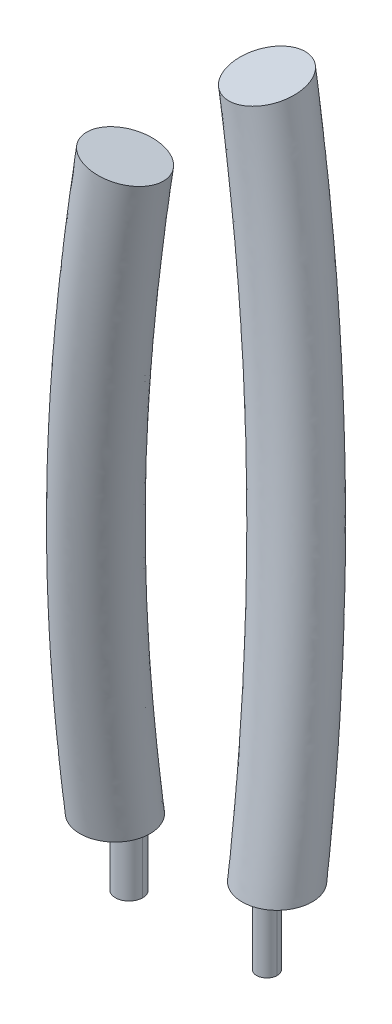
ISO-10303-21;
HEADER;
FILE_DESCRIPTION(('STEP AP214'),'2;1');
FILE_NAME('part.step','',(''),(''),'','','');
FILE_SCHEMA(('AUTOMOTIVE_DESIGN { 1 0 10303 214 1 1 1 1 }'));
ENDSEC;
DATA;
#1=APPLICATION_CONTEXT('core data for automotive mechanical design processes');
#2=APPLICATION_PROTOCOL_DEFINITION('international standard','automotive_design',2000,#1);
#3=PRODUCT_CONTEXT('',#1,'mechanical');
#4=PRODUCT('Part','Part','',(#3));
#5=PRODUCT_RELATED_PRODUCT_CATEGORY('part','',(#4));
#6=PRODUCT_DEFINITION_FORMATION('','',#4);
#7=PRODUCT_DEFINITION_CONTEXT('part definition',#1,'design');
#8=PRODUCT_DEFINITION('design','',#6,#7);
#9=PRODUCT_DEFINITION_SHAPE('','',#8);
#10=(LENGTH_UNIT() NAMED_UNIT(*) SI_UNIT(.MILLI.,.METRE.));
#11=(NAMED_UNIT(*) PLANE_ANGLE_UNIT() SI_UNIT($,.RADIAN.));
#12=(NAMED_UNIT(*) SI_UNIT($,.STERADIAN.) SOLID_ANGLE_UNIT());
#13=UNCERTAINTY_MEASURE_WITH_UNIT(LENGTH_MEASURE(1.E-05),#10,'distance_accuracy_value','');
#14=(GEOMETRIC_REPRESENTATION_CONTEXT(3) GLOBAL_UNCERTAINTY_ASSIGNED_CONTEXT((#13)) GLOBAL_UNIT_ASSIGNED_CONTEXT((#10,
#11,#12)) REPRESENTATION_CONTEXT('',''));
#15=CARTESIAN_POINT('',(0.,0.,0.));
#16=DIRECTION('',(0.,0.,1.));
#17=DIRECTION('',(1.,0.,0.));
#18=AXIS2_PLACEMENT_3D('',#15,#16,#17);
#19=CARTESIAN_POINT('',(0.,0.,0.));
#20=DIRECTION('',(0.,1.,0.));
#21=DIRECTION('',(0.,0.,1.));
#22=AXIS2_PLACEMENT_3D('',#19,#20,#21);
#23=PLANE('',#22);
#24=CARTESIAN_POINT('',(-0.956231117249001,0.,0.));
#25=DIRECTION('',(0.,-1.,0.));
#26=DIRECTION('',(0.,0.,-1.));
#27=AXIS2_PLACEMENT_3D('',#24,#25,#26);
#28=CIRCLE('',#27,0.193254320975);
#29=CARTESIAN_POINT('',(-1.149485438224,0.,0.));
#30=VERTEX_POINT('',#29);
#31=CARTESIAN_POINT('',(-0.762976796274001,0.,0.));
#32=VERTEX_POINT('',#31);
#33=EDGE_CURVE('P0_E46',#30,#32,#28,.F.);
#34=ORIENTED_EDGE('',*,*,#33,.F.);
#35=CARTESIAN_POINT('',(-0.956231117249001,0.,0.));
#36=DIRECTION('',(0.,-1.,0.));
#37=DIRECTION('',(0.,0.,-1.));
#38=AXIS2_PLACEMENT_3D('',#35,#36,#37);
#39=CIRCLE('',#38,0.193254320975);
#40=EDGE_CURVE('P0_E19',#32,#30,#39,.F.);
#41=ORIENTED_EDGE('',*,*,#40,.F.);
#42=EDGE_LOOP('',(#34,#41));
#43=FACE_BOUND('',#42,.T.);
#44=ADVANCED_FACE('P0_F16',(#43),#23,.F.);
#45=CARTESIAN_POINT('',(-0.956231117249001,0.5,0.));
#46=DIRECTION('',(0.,-1.,0.));
#47=DIRECTION('',(0.,0.,-1.));
#48=AXIS2_PLACEMENT_3D('',#45,#46,#47);
#49=CYLINDRICAL_SURFACE('',#48,0.193254320975);
#50=ORIENTED_EDGE('',*,*,#40,.T.);
#51=DIRECTION('',(0.,-1.,0.));
#52=VECTOR('',#51,1.);
#53=CARTESIAN_POINT('',(-1.149485438224,0.5,0.));
#54=LINE('',#53,#52);
#55=CARTESIAN_POINT('',(-1.149485438224,1.,0.));
#56=VERTEX_POINT('',#55);
#57=EDGE_CURVE('P0_E54',#56,#30,#54,.T.);
#58=ORIENTED_EDGE('',*,*,#57,.F.);
#59=CARTESIAN_POINT('',(-0.956231117249001,1.,0.));
#60=DIRECTION('',(0.,-1.,0.));
#61=DIRECTION('',(0.,0.,-1.));
#62=AXIS2_PLACEMENT_3D('',#59,#60,#61);
#63=CIRCLE('',#62,0.193254320975);
#64=CARTESIAN_POINT('',(-0.762976796274001,1.,0.));
#65=VERTEX_POINT('',#64);
#66=EDGE_CURVE('P0_E68',#65,#56,#63,.F.);
#67=ORIENTED_EDGE('',*,*,#66,.F.);
#68=DIRECTION('',(0.,-1.,0.));
#69=VECTOR('',#68,1.);
#70=CARTESIAN_POINT('',(-0.762976796274001,0.5,0.));
#71=LINE('',#70,#69);
#72=EDGE_CURVE('P0_E56',#32,#65,#71,.F.);
#73=ORIENTED_EDGE('',*,*,#72,.F.);
#74=EDGE_LOOP('',(#50,#58,#67,#73));
#75=FACE_BOUND('',#74,.T.);
#76=ADVANCED_FACE('P0_F52',(#75),#49,.T.);
#77=CARTESIAN_POINT('',(-0.956231117249001,0.5,0.));
#78=DIRECTION('',(0.,-1.,0.));
#79=DIRECTION('',(0.,0.,-1.));
#80=AXIS2_PLACEMENT_3D('',#77,#78,#79);
#81=CYLINDRICAL_SURFACE('',#80,0.193254320975);
#82=ORIENTED_EDGE('',*,*,#33,.T.);
#83=ORIENTED_EDGE('',*,*,#72,.T.);
#84=CARTESIAN_POINT('',(-0.956231117249001,1.,0.));
#85=DIRECTION('',(0.,-1.,0.));
#86=DIRECTION('',(0.,0.,-1.));
#87=AXIS2_PLACEMENT_3D('',#84,#85,#86);
#88=CIRCLE('',#87,0.193254320975);
#89=EDGE_CURVE('P0_E61',#56,#65,#88,.F.);
#90=ORIENTED_EDGE('',*,*,#89,.F.);
#91=ORIENTED_EDGE('',*,*,#57,.T.);
#92=EDGE_LOOP('',(#82,#83,#90,#91));
#93=FACE_BOUND('',#92,.T.);
#94=ADVANCED_FACE('P0_F59',(#93),#81,.T.);
#95=CARTESIAN_POINT('',(0.987813341373001,9.84483464318,0.987813341373001));
#96=DIRECTION('',(0.151428996103013,0.976213588915081,-0.155165356819013));
#97=DIRECTION('',(0.,0.156975577572689,0.987602484831686));
#98=AXIS2_PLACEMENT_3D('',#95,#96,#97);
#99=PLANE('',#98);
#100=CARTESIAN_POINT('',(-0.506269104120293,10.0795245649109,1.00624584472));
#101=CARTESIAN_POINT('',(-0.505260947537554,10.0837813301359,1.03401090958508));
#102=CARTESIAN_POINT('',(-0.501903312536936,10.0876661599394,1.06172886822156));
#103=CARTESIAN_POINT('',(-0.490588642986283,10.0945950164732,1.11636356973537));
#104=CARTESIAN_POINT('',(-0.482626074332374,10.0976380250054,1.14327930752387));
#105=CARTESIAN_POINT('',(-0.462326871086091,10.1027865042807,1.1954810590372));
#106=CARTESIAN_POINT('',(-0.449992934267402,10.1048925514622,1.22076806657802));
#107=CARTESIAN_POINT('',(-0.42130061310642,10.1081107793624,1.26901676945298));
#108=CARTESIAN_POINT('',(-0.40494211071025,10.1092229309224,1.2919783965481));
#109=CARTESIAN_POINT('',(-0.368665654274767,10.1104214918827,1.33492199564474));
#110=CARTESIAN_POINT('',(-0.348747822335922,10.1105079364624,1.35490406981474));
#111=CARTESIAN_POINT('',(-0.305916882342927,10.109652747313,1.39132327505448));
#112=CARTESIAN_POINT('',(-0.283003656722234,10.1087110732204,1.40776026691575));
#113=CARTESIAN_POINT('',(-0.234849670515615,10.1058273087174,1.43661167929145));
#114=CARTESIAN_POINT('',(-0.209610517926678,10.1038859052587,1.44902885244507));
#115=CARTESIAN_POINT('',(-0.157471828127672,10.0990548571257,1.46951779841927));
#116=CARTESIAN_POINT('',(-0.130570120722603,10.0961639508599,1.47758375194886));
#117=CARTESIAN_POINT('',(-0.0759205293118471,10.0895190813067,1.48911158811195));
#118=CARTESIAN_POINT('',(-0.0481732407897367,10.0857657137406,1.49257663754604));
#119=CARTESIAN_POINT('',(0.00739892286910944,10.0775011676025,1.49481473189501));
#120=CARTESIAN_POINT('',(0.0352238014431222,10.0729899549157,1.49358756553345));
#121=CARTESIAN_POINT('',(0.0901585720242738,10.0633381500564,1.4864757596256));
#122=CARTESIAN_POINT('',(0.117268499483148,10.0581975891623,1.48059135146481));
#123=CARTESIAN_POINT('',(0.170006765677359,10.0474325219921,1.46433190926677));
#124=CARTESIAN_POINT('',(0.195635023827805,10.041807989435,1.45395663124046));
#125=CARTESIAN_POINT('',(0.244663669550219,10.0302389429014,1.42901870750103));
#126=CARTESIAN_POINT('',(0.26806558945066,10.0242946534812,1.41445897000038));
#127=CARTESIAN_POINT('',(0.312027748020974,10.0122429400648,1.38153988953361));
#128=CARTESIAN_POINT('',(0.332584156432529,10.0061353091363,1.363175506639));
#129=CARTESIAN_POINT('',(0.370207983363639,9.9939465712159,1.32320863918377));
#130=CARTESIAN_POINT('',(0.387280130084355,9.98786543938719,1.30161061271027));
#131=CARTESIAN_POINT('',(0.417508150531316,9.9758851940415,1.25573774743593));
#132=CARTESIAN_POINT('',(0.430658496938887,9.96998634782534,1.23145919612052));
#133=CARTESIAN_POINT('',(0.452619748160395,9.95855617367261,1.18097936435931));
#134=CARTESIAN_POINT('',(0.461437276433102,9.95302429603082,1.1547810894428));
#135=CARTESIAN_POINT('',(0.474524211163998,9.94246605696488,1.10112636113496));
#136=CARTESIAN_POINT('',(0.478786003807387,9.93744055447784,1.0736678812202));
#137=CARTESIAN_POINT('',(0.482613968490641,9.92804854203275,1.01831438284252));
#138=CARTESIAN_POINT('',(0.482180140530655,9.92368203207468,0.990419364379611));
#139=CARTESIAN_POINT('',(0.476633973378437,9.91573879874136,0.935032369366834));
#140=CARTESIAN_POINT('',(0.471529429223418,9.91216077179501,0.907539798810871));
#141=CARTESIAN_POINT('',(0.456786010906743,9.90588180230009,0.853647637883457));
#142=CARTESIAN_POINT('',(0.447140184869622,9.90318221523512,0.827249790981019));
#143=CARTESIAN_POINT('',(0.423602496571732,9.89874755395539,0.776378480045671));
#144=CARTESIAN_POINT('',(0.409716601208795,9.89701113392073,0.751902372082963));
#145=CARTESIAN_POINT('',(0.378065957160012,9.89454450989236,0.705495253269818));
#146=CARTESIAN_POINT('',(0.360295928023082,9.89381568569548,0.683567770030391));
#147=CARTESIAN_POINT('',(0.321419380847913,9.89338971724339,0.642947409718558));
#148=CARTESIAN_POINT('',(0.300317336750514,9.89369120062842,0.624250264735543));
#149=CARTESIAN_POINT('',(0.255342212201253,9.89531482591288,0.590573076725535));
#150=CARTESIAN_POINT('',(0.231467219333462,9.8966376758107,0.575595621662889));
#151=CARTESIAN_POINT('',(0.181637217865073,9.90026723866851,0.549800698129511));
#152=CARTESIAN_POINT('',(0.155682322350299,9.9025738981675,0.538983003674752));
#153=CARTESIAN_POINT('',(0.102426754113464,9.90810573572821,0.52181304840052));
#154=CARTESIAN_POINT('',(0.0751260145941709,9.91133095941835,0.515461009460726));
#155=CARTESIAN_POINT('',(0.0199562751178808,9.91860814719594,0.50740374273523));
#156=CARTESIAN_POINT('',(-0.00791269919755409,9.92266007405243,0.505698305737367));
#157=CARTESIAN_POINT('',(-0.0634483075558613,9.93147880958214,0.506982535960994));
#158=CARTESIAN_POINT('',(-0.0911147889246117,9.93624610897875,0.50997543953717));
#159=CARTESIAN_POINT('',(-0.145403066839244,9.94635122833846,0.520570171761748));
#160=CARTESIAN_POINT('',(-0.172026206130195,9.95168827972284,0.528165854531095));
#161=CARTESIAN_POINT('',(-0.223529911797674,9.96279066938617,0.54775237355857));
#162=CARTESIAN_POINT('',(-0.248409269006033,9.96855629925041,0.559746224359752));
#163=CARTESIAN_POINT('',(-0.295697949649511,9.98034867280351,0.587787263719605));
#164=CARTESIAN_POINT('',(-0.318107370018242,9.98637540623232,0.603834293128322));
#165=CARTESIAN_POINT('',(-0.359821930896534,9.99851937813945,0.639527288242959));
#166=CARTESIAN_POINT('',(-0.379126964906217,10.0046366197149,0.65917337736971));
#167=CARTESIAN_POINT('',(-0.414083346820323,10.0167874303158,0.701504840594128));
#168=CARTESIAN_POINT('',(-0.429734801892504,10.0228210017906,0.72419012551456));
#169=CARTESIAN_POINT('',(-0.456948550026285,10.0346375410041,0.771974732511432));
#170=CARTESIAN_POINT('',(-0.468508316357693,10.0404203519643,0.797075534111202));
#171=CARTESIAN_POINT('',(-0.487186669501557,10.0515584875905,0.848921869256242));
#172=CARTESIAN_POINT('',(-0.494310581587915,10.0569143180848,0.875665388147101));
#173=CARTESIAN_POINT('',(-0.50512587384178,10.0683197327002,0.936867012526723));
#174=CARTESIAN_POINT('',(-0.507527353505232,10.0742118264753,0.971593116773343));
#175=CARTESIAN_POINT('',(-0.506269104120293,10.0795245649109,1.00624584472));
#176=B_SPLINE_CURVE_WITH_KNOTS('',3,(#100,#101,#102,#103,#104,#105,#106,#107,#108,#109,#110,
#111,#112,#113,#114,#115,#116,#117,#118,#119,#120,#121,#122,#123,#124,#125,#126,#127,#128,#129,
#130,#131,#132,#133,#134,#135,#136,#137,#138,#139,#140,#141,#142,#143,#144,#145,#146,#147,#148,
#149,#150,#151,#152,#153,#154,#155,#156,#157,#158,#159,#160,#161,#162,#163,#164,#165,#166,#167,
#168,#169,#170,#171,#172,#173,#174,#175),.UNSPECIFIED.,.T.,.F.,(4,2,2,2,2,2,2,2,2,2,2,2,2,2,2,2,
2,2,2,2,2,2,2,2,2,2,2,2,2,2,2,2,2,2,2,2,2,4),(0.,0.084191603812493,0.168484598046045,
0.252725661495634,0.336969196310121,0.421209841759927,0.505453794573552,0.589639937282029,
0.673938392570009,0.758178795132454,0.842422990832698,0.92666300129583,1.01090758909495,
1.09509376764645,1.17939218709014,1.26357544020016,1.34787678505799,1.43204885675008,
1.51636138290278,1.60067390905282,1.68484598074221,1.76914732560252,1.85333057871515,
1.93762899815938,2.02181517671146,2.106059764511,2.19029977497459,2.27454397067501,
2.35878437323759,2.44308282852515,2.52726897123328,2.61151292404623,2.69575356949507,
2.77999710430893,2.86423816775821,2.94853116199142,3.0327227658033,3.13779973056044),.UNSPECIFIED.);
#177=CARTESIAN_POINT('',(-0.506269104120293,10.0795245649109,1.00624584472));
#178=VERTEX_POINT('',#177);
#179=EDGE_CURVE('P0_E26',#178,#178,#176,.T.);
#180=ORIENTED_EDGE('',*,*,#179,.T.);
#181=EDGE_LOOP('',(#180));
#182=FACE_BOUND('',#181,.T.);
#183=ADVANCED_FACE('P0_F88',(#182),#99,.T.);
#184=CARTESIAN_POINT('',(0.,1.,0.));
#185=DIRECTION('',(0.,-1.,0.));
#186=DIRECTION('',(0.,0.,-1.));
#187=AXIS2_PLACEMENT_3D('',#184,#185,#186);
#188=PLANE('',#187);
#189=ORIENTED_EDGE('',*,*,#66,.T.);
#190=ORIENTED_EDGE('',*,*,#89,.T.);
#191=EDGE_LOOP('',(#189,#190));
#192=FACE_BOUND('',#191,.T.);
#193=CARTESIAN_POINT('',(-1.50035786804304,1.,0.156365584134835));
#194=CARTESIAN_POINT('',(-1.5004608842237,1.,0.128348709359291));
#195=CARTESIAN_POINT('',(-1.49819778701348,1.,0.100342505934758));
#196=CARTESIAN_POINT('',(-1.48900357452294,0.999999999999999,0.045062846648729));
#197=CARTESIAN_POINT('',(-1.48206704196627,0.999999999999995,0.0177902793869721));
#198=CARTESIAN_POINT('',(-1.46371145529497,1.,-0.0351849092875141));
#199=CARTESIAN_POINT('',(-1.45229458550649,1.00000000000002,-0.0608882886901258));
#200=CARTESIAN_POINT('',(-1.42529947843465,0.999999999999985,-0.110009631362051));
#201=CARTESIAN_POINT('',(-1.4097211742752,0.999999999999943,-0.133427557894875));
#202=CARTESIAN_POINT('',(-1.37487806658665,0.999999999999943,-0.177266419655311));
#203=CARTESIAN_POINT('',(-1.35562017089401,0.999999999999985,-0.197692845979856));
#204=CARTESIAN_POINT('',(-1.31394641824274,1.00000000000002,-0.235021486100481));
#205=CARTESIAN_POINT('',(-1.29153046056062,1.,-0.251923587448801));
#206=CARTESIAN_POINT('',(-1.2442057980502,0.999999999999996,-0.281709238172104));
#207=CARTESIAN_POINT('',(-1.21929983092817,0.999999999999999,-0.294597138255301));
#208=CARTESIAN_POINT('',(-1.16764717421988,1.,-0.316034846345034));
#209=CARTESIAN_POINT('',(-1.14089806311904,1.,-0.324578818985901));
#210=CARTESIAN_POINT('',(-1.08631373586228,0.999999999999999,-0.337076336908561));
#211=CARTESIAN_POINT('',(-1.05847721851566,1.,-0.341024197045201));
#212=CARTESIAN_POINT('',(-1.00253453239311,1.,-0.344207997036625));
#213=CARTESIAN_POINT('',(-0.974428343388665,1.,-0.343443580613049));
#214=CARTESIAN_POINT('',(-0.918643480993769,1.,-0.337221743916044));
#215=CARTESIAN_POINT('',(-0.890966588929231,0.999999999999999,-0.331748354558699));
#216=CARTESIAN_POINT('',(-0.836916731217575,1.,-0.31624894382472));
#217=CARTESIAN_POINT('',(-0.810543863018822,1.00000000000001,-0.306222582777634));
#218=CARTESIAN_POINT('',(-0.759772699757621,1.00000000000001,-0.28187058356781));
#219=CARTESIAN_POINT('',(-0.73538015318772,1.,-0.267532960197675));
#220=CARTESIAN_POINT('',(-0.689308719030558,0.999999999999999,-0.234954438337665));
#221=CARTESIAN_POINT('',(-0.667633531156166,1.,-0.216708307933375));
#222=CARTESIAN_POINT('',(-0.627638566024479,1.,-0.176830976572493));
#223=CARTESIAN_POINT('',(-0.609320444963431,0.999999999999999,-0.155198114490728));
#224=CARTESIAN_POINT('',(-0.576546732474856,1.,-0.109126412388754));
#225=CARTESIAN_POINT('',(-0.56209763021307,1.00000000000001,-0.0846829553194162));
#226=CARTESIAN_POINT('',(-0.537524629363408,0.999999999999997,-0.03372443894938));
#227=CARTESIAN_POINT('',(-0.527398744924007,0.999999999999985,-0.00721033742540048));
#228=CARTESIAN_POINT('',(-0.511771773316084,1.00000000000001,0.0471009250426322));
#229=CARTESIAN_POINT('',(-0.506263162763886,1.00000000000006,0.0748959206148224));
#230=CARTESIAN_POINT('',(-0.500015031138764,1.00000000000006,0.130964643546581));
#231=CARTESIAN_POINT('',(-0.499266622037075,1.00000000000002,0.159237379819447));
#232=CARTESIAN_POINT('',(-0.502545973420364,0.999999999999985,0.215502873660706));
#233=CARTESIAN_POINT('',(-0.506573348449895,0.999999999999996,0.243495653640607));
#234=CARTESIAN_POINT('',(-0.519272843076971,1.,0.298297524987755));
#235=CARTESIAN_POINT('',(-0.527927674824567,1.,0.325110622630855));
#236=CARTESIAN_POINT('',(-0.549629691470085,0.999999999999999,0.376894490698036));
#237=CARTESIAN_POINT('',(-0.562676579673579,1.,0.401865385428667));
#238=CARTESIAN_POINT('',(-0.592756381911376,1.,0.449192811317491));
#239=CARTESIAN_POINT('',(-0.609779534560019,1.,0.471555546883358));
#240=CARTESIAN_POINT('',(-0.647319454017895,1.,0.51307140488102));
#241=CARTESIAN_POINT('',(-0.667831523709135,1.,0.532228774786566));
#242=CARTESIAN_POINT('',(-0.711772331517792,1.,0.566820977004129));
#243=CARTESIAN_POINT('',(-0.735199952065666,1.,0.582257229047162));
#244=CARTESIAN_POINT('',(-0.784309927531747,1.,0.60898273240931));
#245=CARTESIAN_POINT('',(-0.80999216974511,1.,0.620272190873759));
#246=CARTESIAN_POINT('',(-0.862922325330329,1.,0.638405991843061));
#247=CARTESIAN_POINT('',(-0.890172465223268,1.,0.645243834275488));
#248=CARTESIAN_POINT('',(-0.945431602621775,1.,0.654263333338952));
#249=CARTESIAN_POINT('',(-0.973440588333186,1.,0.656445062294389));
#250=CARTESIAN_POINT('',(-1.02953909597929,1.,0.656099390349216));
#251=CARTESIAN_POINT('',(-1.05762850430313,1.,0.653553533050036));
#252=CARTESIAN_POINT('',(-1.11294828049717,1.,0.64380327320705));
#253=CARTESIAN_POINT('',(-1.14017971779322,1.,0.636604931931413));
#254=CARTESIAN_POINT('',(-1.19317310559319,1.,0.617723546396409));
#255=CARTESIAN_POINT('',(-1.21892823356832,1.,0.606021350424069));
#256=CARTESIAN_POINT('',(-1.26811435014393,1.,0.578470001941614));
#257=CARTESIAN_POINT('',(-1.29154539216137,0.999999999999999,0.562620944773728));
#258=CARTESIAN_POINT('',(-1.33547852707387,0.999999999999999,0.527180165252237));
#259=CARTESIAN_POINT('',(-1.35597322321546,1.,0.507579271984436));
#260=CARTESIAN_POINT('',(-1.3933816416812,1.,0.46521716994935));
#261=CARTESIAN_POINT('',(-1.41029547582756,1.,0.44245605990525));
#262=CARTESIAN_POINT('',(-1.44007216717533,1.,0.394392482759653));
#263=CARTESIAN_POINT('',(-1.45293157060783,1.,0.369087873042556));
#264=CARTESIAN_POINT('',(-1.47419541848673,1.,0.316717223403416));
#265=CARTESIAN_POINT('',(-1.48260522368378,1.,0.289653347360505));
#266=CARTESIAN_POINT('',(-1.49629801481369,1.,0.227382125442541));
#267=CARTESIAN_POINT('',(-1.50022733799735,1.,0.191865288365974));
#268=CARTESIAN_POINT('',(-1.50035786804304,1.,0.156365584134835));
#269=B_SPLINE_CURVE_WITH_KNOTS('',3,(#193,#194,#195,#196,#197,#198,#199,#200,#201,#202,#203,
#204,#205,#206,#207,#208,#209,#210,#211,#212,#213,#214,#215,#216,#217,#218,#219,#220,#221,#222,
#223,#224,#225,#226,#227,#228,#229,#230,#231,#232,#233,#234,#235,#236,#237,#238,#239,#240,#241,
#242,#243,#244,#245,#246,#247,#248,#249,#250,#251,#252,#253,#254,#255,#256,#257,#258,#259,#260,
#261,#262,#263,#264,#265,#266,#267,#268),.UNSPECIFIED.,.T.,.F.,(4,2,2,2,2,2,2,2,2,2,2,2,2,2,2,2,
2,2,2,2,2,2,2,2,2,2,2,2,2,2,2,2,2,2,2,2,2,4),(0.,0.0839191420163342,0.167935727796411,
0.251911403244371,0.335888428299487,0.419709322182167,0.503532890060572,0.587265288813188,
0.671109873292562,0.755058059212508,0.839012592232113,0.923252959426419,1.00749961233208,
1.09198266888544,1.17657952886279,1.2612180126859,1.3459975764539,1.43073815508562,
1.5153403875588,1.59978460815646,1.68422201369114,1.76834614896586,1.85246460258425,
1.9363786836261,2.02018067288497,2.10395063809528,2.18771641816406,2.27160423698052,
2.35549075274019,2.43970544841649,2.52381064952067,2.60827751416114,2.69274243695906,
2.77741652346778,2.86208796540618,2.9468313410915,3.03147238651818,3.13780490021851),.UNSPECIFIED.);
#270=CARTESIAN_POINT('',(-1.50035786804304,1.,0.156365584134835));
#271=VERTEX_POINT('',#270);
#272=EDGE_CURVE('P0_E11',#271,#271,#269,.T.);
#273=ORIENTED_EDGE('',*,*,#272,.T.);
#274=EDGE_LOOP('',(#273));
#275=FACE_BOUND('',#274,.T.);
#276=ADVANCED_FACE('P0_F92',(#192,#275),#188,.T.);
#277=CARTESIAN_POINT('',(-1.51251494884,0.,0.));
#278=CARTESIAN_POINT('',(-1.51251494884,0.,2.));
#279=CARTESIAN_POINT('',(0.487485051155,0.,1.));
#280=CARTESIAN_POINT('',(0.487485051155,0.,-1.));
#281=CARTESIAN_POINT('',(-1.51251494884,0.,-2.));
#282=CARTESIAN_POINT('',(-1.51251494884,0.,0.));
#283=CARTESIAN_POINT('',(-1.51251494889,2.0317842466,0.319151941971));
#284=CARTESIAN_POINT('',(-1.49733205582,2.03178424642,2.31915194198));
#285=CARTESIAN_POINT('',(0.49507649767,1.93512693964,1.30396904658));
#286=CARTESIAN_POINT('',(0.47989360455,1.93512693982,-0.696030953631));
#287=CARTESIAN_POINT('',(-1.52769784196,2.03178424679,-1.68084805825));
#288=CARTESIAN_POINT('',(-1.51251494889,2.0317842466,0.319151941971));
#289=CARTESIAN_POINT('',(-1.38674469461,4.06368746816,0.637546559239));
#290=CARTESIAN_POINT('',(-1.35933398124,4.1008606035,2.6374023603));
#291=CARTESIAN_POINT('',(0.620977483951,3.88849514312,1.61006387781));
#292=CARTESIAN_POINT('',(0.59356674387,3.85132200801,-0.38979185493));
#293=CARTESIAN_POINT('',(-1.41415540798,4.02651433282,-1.36230930453));
#294=CARTESIAN_POINT('',(-1.38674469461,4.06368746816,0.637546559239));
#295=CARTESIAN_POINT('',(-1.13593463826,6.07089006325,0.883712551017001));
#296=CARTESIAN_POINT('',(-1.09683778803,6.18352425452,2.88368691819));
#297=CARTESIAN_POINT('',(0.865437774574001,5.85656395609,1.85643064268));
#298=CARTESIAN_POINT('',(0.826341012838,5.74392955196,-0.143543697606));
#299=CARTESIAN_POINT('',(-1.17503148848,5.95825565912,-1.11626189048));
#300=CARTESIAN_POINT('',(-1.13593463826,6.07089006325,0.883712551017001));
#301=CARTESIAN_POINT('',(-0.820355032055,8.07999156209,1.00624584507));
#302=CARTESIAN_POINT('',(-0.763348601026,8.28774042502,2.99699654644));
#303=CARTESIAN_POINT('',(1.18395917747,7.87470864184,1.97724787699));
#304=CARTESIAN_POINT('',(1.12695274663,7.66695977813,-0.0135028241352));
#305=CARTESIAN_POINT('',(-0.877361463084001,7.87224269837,-0.984504856006001));
#306=CARTESIAN_POINT('',(-0.820355032055,8.07999156209,1.00624584507));
#307=CARTESIAN_POINT('',(-0.506269104122,10.0795245649,1.00624584472));
#308=CARTESIAN_POINT('',(-0.434322964699,10.3823825571,2.98187252747));
#309=CARTESIAN_POINT('',(1.50533064834,9.92062284738,1.96968586884));
#310=CARTESIAN_POINT('',(1.43338450891,9.61776485517,-0.00594081390411));
#311=CARTESIAN_POINT('',(-0.578215243546,9.77666657271,-0.969380838024001));
#312=CARTESIAN_POINT('',(-0.506269104122,10.0795245649,1.00624584472));
#313=(BOUNDED_SURFACE() B_SPLINE_SURFACE(5,5,((#277,#278,#279,#280,#281,#282),(#283,#284,#285,
#286,#287,#288),(#289,#290,#291,#292,#293,#294),(#295,#296,#297,#298,#299,#300),(#301,#302,#303,
#304,#305,#306),(#307,#308,#309,#310,#311,#312)),.UNSPECIFIED.,.F.,.T.,
.F.) B_SPLINE_SURFACE_WITH_KNOTS((6,6),(6,6),(0.,10.1231631988),(0.,3.14159265359),
.UNSPECIFIED.) GEOMETRIC_REPRESENTATION_ITEM() RATIONAL_B_SPLINE_SURFACE(((1.,0.2,0.2,0.2,0.2,
1.),(1.,0.2,0.2,0.2,0.2,1.),(1.,0.2,0.2,0.2,0.2,1.),(1.,0.2,0.2,0.2,0.2,1.),(1.,0.2,0.2,0.2,0.2,
1.),(1.,0.2,0.2,0.2,0.2,1.))) REPRESENTATION_ITEM('') SURFACE());
#314=ORIENTED_EDGE('',*,*,#272,.F.);
#315=EDGE_LOOP('',(#314));
#316=FACE_BOUND('',#315,.T.);
#317=ORIENTED_EDGE('',*,*,#179,.F.);
#318=EDGE_LOOP('',(#317));
#319=FACE_BOUND('',#318,.T.);
#320=ADVANCED_FACE('P0_F84',(#316,#319),#313,.F.);
#321=CLOSED_SHELL('',(#44,#76,#94,#183,#276,#320));
#322=MANIFOLD_SOLID_BREP('P0_B1',#321);
#323=CARTESIAN_POINT('',(0.,0.,0.));
#324=DIRECTION('',(0.,1.,0.));
#325=DIRECTION('',(0.,0.,1.));
#326=AXIS2_PLACEMENT_3D('',#323,#324,#325);
#327=PLANE('',#326);
#328=CARTESIAN_POINT('',(1.00340008736,0.,0.));
#329=DIRECTION('',(0.,-1.,0.));
#330=DIRECTION('',(0.,0.,-1.));
#331=AXIS2_PLACEMENT_3D('',#328,#329,#330);
#332=CIRCLE('',#331,0.146623174374);
#333=CARTESIAN_POINT('',(0.856776912986,0.,0.));
#334=VERTEX_POINT('',#333);
#335=CARTESIAN_POINT('',(1.150023261734,0.,0.));
#336=VERTEX_POINT('',#335);
#337=EDGE_CURVE('P1_E46',#334,#336,#332,.F.);
#338=ORIENTED_EDGE('',*,*,#337,.F.);
#339=CARTESIAN_POINT('',(1.00340008736,0.,0.));
#340=DIRECTION('',(0.,-1.,0.));
#341=DIRECTION('',(0.,0.,-1.));
#342=AXIS2_PLACEMENT_3D('',#339,#340,#341);
#343=CIRCLE('',#342,0.146623174374);
#344=EDGE_CURVE('P1_E19',#336,#334,#343,.F.);
#345=ORIENTED_EDGE('',*,*,#344,.F.);
#346=EDGE_LOOP('',(#338,#345));
#347=FACE_BOUND('',#346,.T.);
#348=ADVANCED_FACE('P1_F16',(#347),#327,.F.);
#349=CARTESIAN_POINT('',(1.00340008736,0.5,0.));
#350=DIRECTION('',(0.,-1.,0.));
#351=DIRECTION('',(0.,0.,-1.));
#352=AXIS2_PLACEMENT_3D('',#349,#350,#351);
#353=CYLINDRICAL_SURFACE('',#352,0.146623174374);
#354=ORIENTED_EDGE('',*,*,#344,.T.);
#355=DIRECTION('',(0.,-1.,0.));
#356=VECTOR('',#355,1.);
#357=CARTESIAN_POINT('',(0.856776912986,0.5,0.));
#358=LINE('',#357,#356);
#359=CARTESIAN_POINT('',(0.856776912986,1.,0.));
#360=VERTEX_POINT('',#359);
#361=EDGE_CURVE('P1_E54',#360,#334,#358,.T.);
#362=ORIENTED_EDGE('',*,*,#361,.F.);
#363=CARTESIAN_POINT('',(1.00340008736,1.,0.));
#364=DIRECTION('',(0.,-1.,0.));
#365=DIRECTION('',(0.,0.,-1.));
#366=AXIS2_PLACEMENT_3D('',#363,#364,#365);
#367=CIRCLE('',#366,0.146623174374);
#368=CARTESIAN_POINT('',(1.150023261734,1.,0.));
#369=VERTEX_POINT('',#368);
#370=EDGE_CURVE('P1_E68',#369,#360,#367,.F.);
#371=ORIENTED_EDGE('',*,*,#370,.F.);
#372=DIRECTION('',(0.,-1.,0.));
#373=VECTOR('',#372,1.);
#374=CARTESIAN_POINT('',(1.150023261734,0.5,0.));
#375=LINE('',#374,#373);
#376=EDGE_CURVE('P1_E56',#336,#369,#375,.F.);
#377=ORIENTED_EDGE('',*,*,#376,.F.);
#378=EDGE_LOOP('',(#354,#362,#371,#377));
#379=FACE_BOUND('',#378,.T.);
#380=ADVANCED_FACE('P1_F52',(#379),#353,.T.);
#381=CARTESIAN_POINT('',(1.00340008736,0.5,0.));
#382=DIRECTION('',(0.,-1.,0.));
#383=DIRECTION('',(0.,0.,-1.));
#384=AXIS2_PLACEMENT_3D('',#381,#382,#383);
#385=CYLINDRICAL_SURFACE('',#384,0.146623174374);
#386=ORIENTED_EDGE('',*,*,#337,.T.);
#387=ORIENTED_EDGE('',*,*,#376,.T.);
#388=CARTESIAN_POINT('',(1.00340008736,1.,0.));
#389=DIRECTION('',(0.,-1.,0.));
#390=DIRECTION('',(0.,0.,-1.));
#391=AXIS2_PLACEMENT_3D('',#388,#389,#390);
#392=CIRCLE('',#391,0.146623174374);
#393=EDGE_CURVE('P1_E61',#360,#369,#392,.F.);
#394=ORIENTED_EDGE('',*,*,#393,.F.);
#395=ORIENTED_EDGE('',*,*,#361,.T.);
#396=EDGE_LOOP('',(#386,#387,#394,#395));
#397=FACE_BOUND('',#396,.T.);
#398=ADVANCED_FACE('P1_F59',(#397),#385,.T.);
#399=CARTESIAN_POINT('',(0.,1.,0.));
#400=DIRECTION('',(0.,-1.,0.));
#401=DIRECTION('',(0.,0.,-1.));
#402=AXIS2_PLACEMENT_3D('',#399,#400,#401);
#403=PLANE('',#402);
#404=ORIENTED_EDGE('',*,*,#370,.T.);
#405=ORIENTED_EDGE('',*,*,#393,.T.);
#406=EDGE_LOOP('',(#404,#405));
#407=FACE_BOUND('',#406,.T.);
#408=CARTESIAN_POINT('',(1.49272753186798,1.,-0.156371493514835));
#409=CARTESIAN_POINT('',(1.49283549673393,1.,-0.128335855882854));
#410=CARTESIAN_POINT('',(1.49056775780117,1.,-0.100332393979143));
#411=CARTESIAN_POINT('',(1.48136882831849,1.,-0.0450597374217926));
#412=CARTESIAN_POINT('',(1.4744343285477,1.,-0.0177910781004045));
#413=CARTESIAN_POINT('',(1.45608144755744,1.,0.0351801431087029));
#414=CARTESIAN_POINT('',(1.44466420130778,1.,0.0608830995095867));
#415=CARTESIAN_POINT('',(1.41766882938357,1.,0.110003938683962));
#416=CARTESIAN_POINT('',(1.40209070860092,1.,0.133421824143958));
#417=CARTESIAN_POINT('',(1.36724766536808,1.,0.17726077110591));
#418=CARTESIAN_POINT('',(1.34798959340029,1.,0.19768727838357));
#419=CARTESIAN_POINT('',(1.3063158145056,1.,0.23501576897925));
#420=CARTESIAN_POINT('',(1.28390005881272,1.,0.251917697855108));
#421=CARTESIAN_POINT('',(1.23657505502772,1.,0.281703548093856));
#422=CARTESIAN_POINT('',(1.21166846198855,1.,0.2945916888104));
#423=CARTESIAN_POINT('',(1.16001579021668,1.,0.316029126233311));
#424=CARTESIAN_POINT('',(1.13326738047366,1.,0.324572805563848));
#425=CARTESIAN_POINT('',(1.07868319401151,1.,0.337070272071493));
#426=CARTESIAN_POINT('',(1.05084606586357,1.,0.341018154690796));
#427=CARTESIAN_POINT('',(0.994903456947724,1.,0.344201739879074));
#428=CARTESIAN_POINT('',(0.966797967922683,1.,0.343437296985997));
#429=CARTESIAN_POINT('',(0.910995169868432,1.,0.337213440205608));
#430=CARTESIAN_POINT('',(0.883300002811296,1.,0.331734819303093));
#431=CARTESIAN_POINT('',(0.829251905573766,1.,0.316229420513214));
#432=CARTESIAN_POINT('',(0.802897338929723,1.,0.30620834333924));
#433=CARTESIAN_POINT('',(0.752124844288231,1.,0.28185569533888));
#434=CARTESIAN_POINT('',(0.727715491464075,1.,0.267506243444193));
#435=CARTESIAN_POINT('',(0.681647905929683,1.,0.234922179958664));
#436=CARTESIAN_POINT('',(0.659989452698505,1.,0.216687880103855));
#437=CARTESIAN_POINT('',(0.619991222271351,1.,0.176807430730614));
#438=CARTESIAN_POINT('',(0.601658445000177,1.,0.155154260150348));
#439=CARTESIAN_POINT('',(0.568891386415224,1.,0.109077106321233));
#440=CARTESIAN_POINT('',(0.554456792863961,1.,0.0846533452143546));
#441=CARTESIAN_POINT('',(0.529891340702572,1.,0.0337125263855296));
#442=CARTESIAN_POINT('',(0.519763396840787,1.,0.00719406531502485));
#443=CARTESIAN_POINT('',(0.504138475296985,0.999999999999999,-0.0471261414402107));
#444=CARTESIAN_POINT('',(0.498631552323423,0.999999999999995,-0.0749249946571143));
#445=CARTESIAN_POINT('',(0.493972128693156,1.,-0.11672142958919));
#446=CARTESIAN_POINT('',(0.493011746004534,1.00000000000001,-0.130537426589716));
#447=CARTESIAN_POINT('',(0.492431961994067,1.,-0.151277042748041));
#448=CARTESIAN_POINT('',(0.492382042762395,1.,-0.158190612613159));
#449=CARTESIAN_POINT('',(0.492854104243166,0.999999999999995,-0.192852255798263));
#450=CARTESIAN_POINT('',(0.49555248965496,0.999999999999999,-0.220609866507654));
#451=CARTESIAN_POINT('',(0.505566880963453,1.,-0.275484009910328));
#452=CARTESIAN_POINT('',(0.51291911884592,1.,-0.30259376432466));
#453=CARTESIAN_POINT('',(0.532084138655679,0.999999999999999,-0.35523347557986));
#454=CARTESIAN_POINT('',(0.543902568436478,1.,-0.3807613842747));
#455=CARTESIAN_POINT('',(0.571649606050154,1.,-0.429432744116238));
#456=CARTESIAN_POINT('',(0.587573137496696,1.,-0.452579091200032));
#457=CARTESIAN_POINT('',(0.623086048045369,1.,-0.495866018778112));
#458=CARTESIAN_POINT('',(0.642675545080659,1.,-0.516006502537079));
#459=CARTESIAN_POINT('',(0.684930239169254,1.,-0.552680839715774));
#460=CARTESIAN_POINT('',(0.707590908831685,1.,-0.569219910348734));
#461=CARTESIAN_POINT('',(0.755365951718044,1.,-0.598264200073394));
#462=CARTESIAN_POINT('',(0.780480449835455,1.,-0.610769213702599));
#463=CARTESIAN_POINT('',(0.832458598038863,1.,-0.631400372789366));
#464=CARTESIAN_POINT('',(0.859322916637065,1.,-0.639524833544811));
#465=CARTESIAN_POINT('',(0.914068553977236,1.,-0.651174169386178));
#466=CARTESIAN_POINT('',(0.941951198450766,1.,-0.654692811702092));
#467=CARTESIAN_POINT('',(0.997955267801185,1.,-0.657021670344289));
#468=CARTESIAN_POINT('',(1.02607699541266,1.,-0.655824592139109));
#469=CARTESIAN_POINT('',(1.08177150833373,0.999999999999998,-0.648742119342154));
#470=CARTESIAN_POINT('',(1.10934328767705,0.999999999999993,-0.64284881993486));
#471=CARTESIAN_POINT('',(1.16321267067312,0.999999999999993,-0.626507141350941));
#472=CARTESIAN_POINT('',(1.18950523772363,0.999999999999999,-0.616042157976291));
#473=CARTESIAN_POINT('',(1.239923337338,1.,-0.590876146970875));
#474=CARTESIAN_POINT('',(1.26405236283273,0.999999999999999,-0.576182114529997));
#475=CARTESIAN_POINT('',(1.3096103746521,0.999999999999998,-0.542896194212436));
#476=CARTESIAN_POINT('',(1.33102756133442,1.,-0.524288150547261));
#477=CARTESIAN_POINT('',(1.37040696260976,1.,-0.483770056348204));
#478=CARTESIAN_POINT('',(1.38837385586488,0.999999999999999,-0.461864550222373));
#479=CARTESIAN_POINT('',(1.42040361185758,1.,-0.415304942942208));
#480=CARTESIAN_POINT('',(1.43446004892492,1.,-0.390646410074495));
#481=CARTESIAN_POINT('',(1.45821727279616,0.999999999999997,-0.339358275049252));
#482=CARTESIAN_POINT('',(1.46792131367581,0.999999999999988,-0.312730162861231));
#483=CARTESIAN_POINT('',(1.48667384829674,0.999999999999983,-0.2434434390024));
#484=CARTESIAN_POINT('',(1.49256002455138,0.999999999999996,-0.199868740400217));
#485=CARTESIAN_POINT('',(1.49272753186798,1.,-0.156371493514835));
#486=B_SPLINE_CURVE_WITH_KNOTS('',3,(#408,#409,#410,#411,#412,#413,#414,#415,#416,#417,#418,
#419,#420,#421,#422,#423,#424,#425,#426,#427,#428,#429,#430,#431,#432,#433,#434,#435,#436,#437,
#438,#439,#440,#441,#442,#443,#444,#445,#446,#447,#448,#449,#450,#451,#452,#453,#454,#455,#456,
#457,#458,#459,#460,#461,#462,#463,#464,#465,#466,#467,#468,#469,#470,#471,#472,#473,#474,#475,
#476,#477,#478,#479,#480,#481,#482,#483,#484,#485),.UNSPECIFIED.,.T.,.F.,(4,2,2,2,2,2,2,2,2,2,2,
2,2,2,2,2,2,2,2,2,2,2,2,2,2,2,2,2,2,2,2,2,2,2,2,2,2,2,4),(0.,0.0839380821110784,
0.167935747893515,0.251912160321003,0.335888474018227,0.419709956715462,0.503532734059713,
0.58726709588634,0.67110945243847,0.755059408958378,0.839011956893918,0.923308181791568,
1.00749890785685,1.09204231400204,1.17657893859322,1.26129148307483,1.34599724022056,
1.43076023548046,1.51534033377884,1.55684422314578,1.57758275492762,1.66080873918888,
1.7446907750692,1.82867924333288,1.91256434516767,1.99645214602841,2.08021760158754,
2.16398732281349,2.24778923781717,2.33170443994426,2.41574949757407,2.49993632185948,
2.58443148543671,2.66878768259395,2.75349915916217,2.83809494145856,2.92282892153094,
3.00749944407454,3.13772924403836),.UNSPECIFIED.);
#487=CARTESIAN_POINT('',(1.49272753186798,1.,-0.156371493514835));
#488=VERTEX_POINT('',#487);
#489=EDGE_CURVE('P1_E26',#488,#488,#486,.T.);
#490=ORIENTED_EDGE('',*,*,#489,.T.);
#491=EDGE_LOOP('',(#490));
#492=FACE_BOUND('',#491,.T.);
#493=ADVANCED_FACE('P1_F88',(#407,#492),#403,.T.);
#494=CARTESIAN_POINT('',(-0.987813341373001,9.84483464318,-0.987813341373001));
#495=DIRECTION('',(-0.151428996103013,0.976213588915081,0.155165356819013));
#496=DIRECTION('',(0.,-0.156975577572689,0.987602484831686));
#497=AXIS2_PLACEMENT_3D('',#494,#495,#496);
#498=PLANE('',#497);
#499=CARTESIAN_POINT('',(0.498737043421187,10.0783414315301,-1.00615292127916));
#500=CARTESIAN_POINT('',(0.497725269565406,10.0825927863962,-1.03388747733756));
#501=CARTESIAN_POINT('',(0.494372709422298,10.0864790898042,-1.06160975446434));
#502=CARTESIAN_POINT('',(0.483063609442233,10.0934106262557,-1.11625588108257));
#503=CARTESIAN_POINT('',(0.475098093121572,10.0964542022948,-1.14317806596078));
#504=CARTESIAN_POINT('',(0.454794679554882,10.1016030591849,-1.19538630214658));
#505=CARTESIAN_POINT('',(0.442461182721595,10.1037092795502,-1.2206739699002));
#506=CARTESIAN_POINT('',(0.413769141456617,10.1069276838684,-1.26892350954449));
#507=CARTESIAN_POINT('',(0.397410353478494,10.1080398076557,-1.29188524058784));
#508=CARTESIAN_POINT('',(0.361133901403637,10.1092383283037,-1.33482858179683));
#509=CARTESIAN_POINT('',(0.341216479289398,10.1093247948809,-1.35481039442366));
#510=CARTESIAN_POINT('',(0.29838565937904,10.1084696532925,-1.39122978173595));
#511=CARTESIAN_POINT('',(0.275472035693323,10.1075279675731,-1.40766708894633));
#512=CARTESIAN_POINT('',(0.227317000675761,10.1046441375492,-1.43651911264813));
#513=CARTESIAN_POINT('',(0.202077180825357,10.1027026731387,-1.44893655349307));
#514=CARTESIAN_POINT('',(0.149938412667195,10.0978715787656,-1.46942528502255));
#515=CARTESIAN_POINT('',(0.12303737607208,10.0949807348089,-1.47749097593646));
#516=CARTESIAN_POINT('',(0.0683878513645916,10.0883358724798,-1.48901879245372));
#517=CARTESIAN_POINT('',(0.0406399175603622,10.084582408628,-1.4924838658294));
#518=CARTESIAN_POINT('',(-0.0149322314304082,10.0763178327197,-1.4947217585627));
#519=CARTESIAN_POINT('',(-0.0427564466170181,10.0718067206624,-1.49349457791608));
#520=CARTESIAN_POINT('',(-0.0977090292511628,10.0621517827654,-1.48638044383047));
#521=CARTESIAN_POINT('',(-0.124836938949501,10.0570075529711,-1.48049050220885));
#522=CARTESIAN_POINT('',(-0.177573214539293,10.0462418460238,-1.46422509222148));
#523=CARTESIAN_POINT('',(-0.203183483817396,10.0406209891286,-1.45385538372321));
#524=CARTESIAN_POINT('',(-0.25221325232962,10.0290516722885,-1.42891685511118));
#525=CARTESIAN_POINT('',(-0.275631226814656,10.0231029888409,-1.4143451408091));
#526=CARTESIAN_POINT('',(-0.319589297333812,10.0110510480727,-1.38142064039585));
#527=CARTESIAN_POINT('',(-0.340129672797723,10.0049478058287,-1.36306822183881));
#528=CARTESIAN_POINT('',(-0.377753949273614,9.99275894392483,-1.32310101307702));
#529=CARTESIAN_POINT('',(-0.394837548155501,9.98667332585123,-1.30148593799672));
#530=CARTESIAN_POINT('',(-0.42505972504629,9.97469325502285,-1.25560846777546));
#531=CARTESIAN_POINT('',(-0.438198608850472,9.96879878748166,-1.23134627803838));
#532=CARTESIAN_POINT('',(-0.460173786197035,9.95736183870363,-1.18083741492798));
#533=CARTESIAN_POINT('',(-0.469004897596447,9.95181978834807,-1.15458839506089));
#534=CARTESIAN_POINT('',(-0.482073078072528,9.94126202898836,-1.10091838214555));
#535=CARTESIAN_POINT('',(-0.48632075657695,9.93624512883571,-1.07350024901174));
#536=CARTESIAN_POINT('',(-0.489172677396404,9.92925635203189,-1.03231402349648));
#537=CARTESIAN_POINT('',(-0.489547420733037,9.92703198879228,-1.01868529439805));
#538=CARTESIAN_POINT('',(-0.488965320752424,9.92054779479144,-0.977322291442698));
#539=CARTESIAN_POINT('',(-0.486235328339887,9.91655616878658,-0.949544959900789));
#540=CARTESIAN_POINT('',(-0.476151401907417,9.90940029766557,-0.894683116639255));
#541=CARTESIAN_POINT('',(-0.468786731398663,9.90623799789397,-0.867600365983283));
#542=CARTESIAN_POINT('',(-0.449647391885134,9.90084226998142,-0.814974998786548));
#543=CARTESIAN_POINT('',(-0.437878019232358,9.89860773304897,-0.789430575166774));
#544=CARTESIAN_POINT('',(-0.41026065917943,9.89512639804153,-0.740575625805546));
#545=CARTESIAN_POINT('',(-0.394412355568635,9.89387967657546,-0.717265273448181));
#546=CARTESIAN_POINT('',(-0.359089256846265,9.8924094425111,-0.673542860209932));
#547=CARTESIAN_POINT('',(-0.339614778654665,9.89218584053799,-0.653130546321193));
#548=CARTESIAN_POINT('',(-0.297589037967739,9.89276805515378,-0.61577974829322));
#549=CARTESIAN_POINT('',(-0.27503747664816,9.89357397178579,-0.598841601940628));
#550=CARTESIAN_POINT('',(-0.227515822465083,9.89619157756406,-0.568932773385859));
#551=CARTESIAN_POINT('',(-0.202547408975808,9.89800257240496,-0.555959361938116));
#552=CARTESIAN_POINT('',(-0.150853437931137,9.90258147444429,-0.534318063803008));
#553=CARTESIAN_POINT('',(-0.124125666064367,9.90535060694028,-0.525655725011163));
#554=CARTESIAN_POINT('',(-0.0697191072660596,9.91176451229787,-0.51291197181463));
#555=CARTESIAN_POINT('',(-0.042040940886972,9.91540872276311,-0.508827624736394));
#556=CARTESIAN_POINT('',(0.0134970032033321,9.92347026871718,-0.505345762401451));
#557=CARTESIAN_POINT('',(0.0413567809143844,9.92788760420532,-0.505948247140509));
#558=CARTESIAN_POINT('',(0.0964848689400304,9.93737307381681,-0.511824902368667));
#559=CARTESIAN_POINT('',(0.123752788391614,9.9424416235806,-0.51710206928591));
#560=CARTESIAN_POINT('',(0.176869310003652,9.9530763670915,-0.532172440877146));
#561=CARTESIAN_POINT('',(0.202719687034264,9.95864191448301,-0.541959846911857));
#562=CARTESIAN_POINT('',(0.252323010969333,9.97012234999998,-0.565779439683404));
#563=CARTESIAN_POINT('',(0.276074520500377,9.97603747297025,-0.579814506693988));
#564=CARTESIAN_POINT('',(0.320784245521263,9.98804522768073,-0.611727458437089));
#565=CARTESIAN_POINT('',(0.341742671573614,9.99413784599784,-0.629605053226727));
#566=CARTESIAN_POINT('',(0.380274823256055,10.0063284767886,-0.668697377137668));
#567=CARTESIAN_POINT('',(0.397848318705991,10.0124264896009,-0.689912333026244));
#568=CARTESIAN_POINT('',(0.429108892411878,10.0244541179134,-0.735075615933351));
#569=CARTESIAN_POINT('',(0.442796205791082,10.030383743582,-0.759023777463484));
#570=CARTESIAN_POINT('',(0.465909259488893,10.0419120617423,-0.808997009143001));
#571=CARTESIAN_POINT('',(0.475330700602364,10.0475104154573,-0.835024143579665));
#572=CARTESIAN_POINT('',(0.489608744954815,10.0582016358785,-0.888353088343365));
#573=CARTESIAN_POINT('',(0.494474207888499,10.063295466365,-0.91565231588161));
#574=CARTESIAN_POINT('',(0.498925753143844,10.0716853977829,-0.964092716363729));
#575=CARTESIAN_POINT('',(0.499504105907213,10.0751183250879,-0.98512634760618));
#576=CARTESIAN_POINT('',(0.498737043421187,10.0783414315301,-1.00615292127916));
#577=B_SPLINE_CURVE_WITH_KNOTS('',3,(#499,#500,#501,#502,#503,#504,#505,#506,#507,#508,#509,
#510,#511,#512,#513,#514,#515,#516,#517,#518,#519,#520,#521,#522,#523,#524,#525,#526,#527,#528,
#529,#530,#531,#532,#533,#534,#535,#536,#537,#538,#539,#540,#541,#542,#543,#544,#545,#546,#547,
#548,#549,#550,#551,#552,#553,#554,#555,#556,#557,#558,#559,#560,#561,#562,#563,#564,#565,#566,
#567,#568,#569,#570,#571,#572,#573,#574,#575,#576),.UNSPECIFIED.,.T.,.F.,(4,2,2,2,2,2,2,2,2,2,2,
2,2,2,2,2,2,2,2,2,2,2,2,2,2,2,2,2,2,2,2,2,2,2,2,2,2,2,4),(0.,0.0841601375645179,
0.168484597690761,0.252724347772189,0.336969195953797,0.421208317773946,0.505453794214825,
0.589642055494931,0.673938392229266,0.758180691322761,0.842422990492369,0.926719321030856,
1.0109075885071,1.09515398085873,1.17939218676984,1.26363775211345,1.34787678503293,
1.4322169070205,1.51636138248447,1.5577726044221,1.64191707988412,1.72625720186985,
1.81049623478718,1.89474180012848,1.97898000603887,2.06322639838999,2.1474146658664,
2.23171099640502,2.31595329557443,2.40019559466769,2.48449193140238,2.5686801926827,
2.65292566912423,2.73716479094521,2.82140963912692,2.90564938920843,2.98997384933369,
3.07413398689718,3.13793884207865),.UNSPECIFIED.);
#578=CARTESIAN_POINT('',(0.498737043421434,10.0783414315285,-1.00615292127998));
#579=VERTEX_POINT('',#578);
#580=EDGE_CURVE('P1_E11',#579,#579,#577,.T.);
#581=ORIENTED_EDGE('',*,*,#580,.T.);
#582=EDGE_LOOP('',(#581));
#583=FACE_BOUND('',#582,.T.);
#584=ADVANCED_FACE('P1_F92',(#583),#498,.T.);
#585=CARTESIAN_POINT('',(0.504889965057,0.,0.));
#586=CARTESIAN_POINT('',(0.504889965057,0.,2.));
#587=CARTESIAN_POINT('',(2.50488996506,0.,1.));
#588=CARTESIAN_POINT('',(2.50488996506,0.,-1.));
#589=CARTESIAN_POINT('',(0.504889965057,0.,-2.));
#590=CARTESIAN_POINT('',(0.504889965057,0.,0.));
#591=CARTESIAN_POINT('',(0.50488996501,1.97549073555,-0.310309377184));
#592=CARTESIAN_POINT('',(0.520014698956,1.97549073576,1.6896906227));
#593=CARTESIAN_POINT('',(2.51245233218,2.07177779006,0.674565886287));
#594=CARTESIAN_POINT('',(2.49732759823,2.07177778985,-1.32543411363));
#595=CARTESIAN_POINT('',(0.489765231063,1.97549073534,-2.31030937714));
#596=CARTESIAN_POINT('',(0.50488996501,1.97549073555,-0.310309377184));
#597=CARTESIAN_POINT('',(0.383072766866,3.95086743427,-0.621344711022));
#598=CARTESIAN_POINT('',(0.410389786477,3.91397851344,1.3785123338));
#599=CARTESIAN_POINT('',(2.39079362988,4.12545773536,0.351266946165));
#600=CARTESIAN_POINT('',(2.36347664778,4.16234665619,-1.64859008734));
#601=CARTESIAN_POINT('',(0.355755747254,3.98775635509,-2.62120190945));
#602=CARTESIAN_POINT('',(0.383072766866,3.95086743427,-0.621344711022));
#603=CARTESIAN_POINT('',(0.139911926067,5.91897164571,-0.869002171082001));
#604=CARTESIAN_POINT('',(0.178868807035,5.80708084448,1.13104424532));
#605=CARTESIAN_POINT('',(2.14126145955,6.13336817352,0.10372942683));
#606=CARTESIAN_POINT('',(2.10230469535,6.2452585131,-1.89631707554));
#607=CARTESIAN_POINT('',(0.100955102707,6.03086198687,-2.86904863974));
#608=CARTESIAN_POINT('',(0.139911926067,5.91897164571,-0.869002171082001));
#609=CARTESIAN_POINT('',(-0.173855073273,7.9164155498,-0.993966262741001));
#610=CARTESIAN_POINT('',(-0.116907077659,7.70903869746,0.996843594830001));
#611=CARTESIAN_POINT('',(1.83043063989,8.12187988584,-0.0229346525329));
#612=CARTESIAN_POINT('',(1.77348264386,8.32925673817,-2.01374450981));
#613=CARTESIAN_POINT('',(-0.230803068936,8.12379240292,-2.98477611983));
#614=CARTESIAN_POINT('',(-0.173855073273,7.9164155498,-0.993966262741001));
#615=CARTESIAN_POINT('',(-0.489076297964,9.92317607476,-0.993966263021001));
#616=CARTESIAN_POINT('',(-0.417130158541,9.62031808256,0.981660419725001));
#617=CARTESIAN_POINT('',(1.52252345449,10.0820777923,-0.030526238902));
#618=CARTESIAN_POINT('',(1.45057731507,10.3849357845,-2.00615292165));
#619=CARTESIAN_POINT('',(-0.561022437387,10.226034067,-2.96959294577));
#620=CARTESIAN_POINT('',(-0.489076297964,9.92317607476,-0.993966263021001));
#621=(BOUNDED_SURFACE() B_SPLINE_SURFACE(5,5,((#585,#586,#587,#588,#589,#590),(#591,#592,#593,
#594,#595,#596),(#597,#598,#599,#600,#601,#602),(#603,#604,#605,#606,#607,#608),(#609,#610,#611,
#612,#613,#614),(#615,#616,#617,#618,#619,#620)),.UNSPECIFIED.,.F.,.T.,
.F.) B_SPLINE_SURFACE_WITH_KNOTS((6,6),(6,6),(0.,10.1637294795),(0.,3.14159265359),
.UNSPECIFIED.) GEOMETRIC_REPRESENTATION_ITEM() RATIONAL_B_SPLINE_SURFACE(((1.,0.2,0.2,0.2,0.2,
1.),(1.,0.2,0.2,0.2,0.2,1.),(1.,0.2,0.2,0.2,0.2,1.),(1.,0.2,0.2,0.2,0.2,1.),(1.,0.2,0.2,0.2,0.2,
1.),(1.,0.2,0.2,0.2,0.2,1.))) REPRESENTATION_ITEM('') SURFACE());
#622=ORIENTED_EDGE('',*,*,#580,.F.);
#623=EDGE_LOOP('',(#622));
#624=FACE_BOUND('',#623,.T.);
#625=ORIENTED_EDGE('',*,*,#489,.F.);
#626=EDGE_LOOP('',(#625));
#627=FACE_BOUND('',#626,.T.);
#628=ADVANCED_FACE('P1_F84',(#624,#627),#621,.F.);
#629=CLOSED_SHELL('',(#348,#380,#398,#493,#584,#628));
#630=MANIFOLD_SOLID_BREP('P1_B1',#629);
#631=ADVANCED_BREP_SHAPE_REPRESENTATION('',(#18,#322,#630),#14);
#632=SHAPE_DEFINITION_REPRESENTATION(#9,#631);
ENDSEC;
END-ISO-10303-21;
